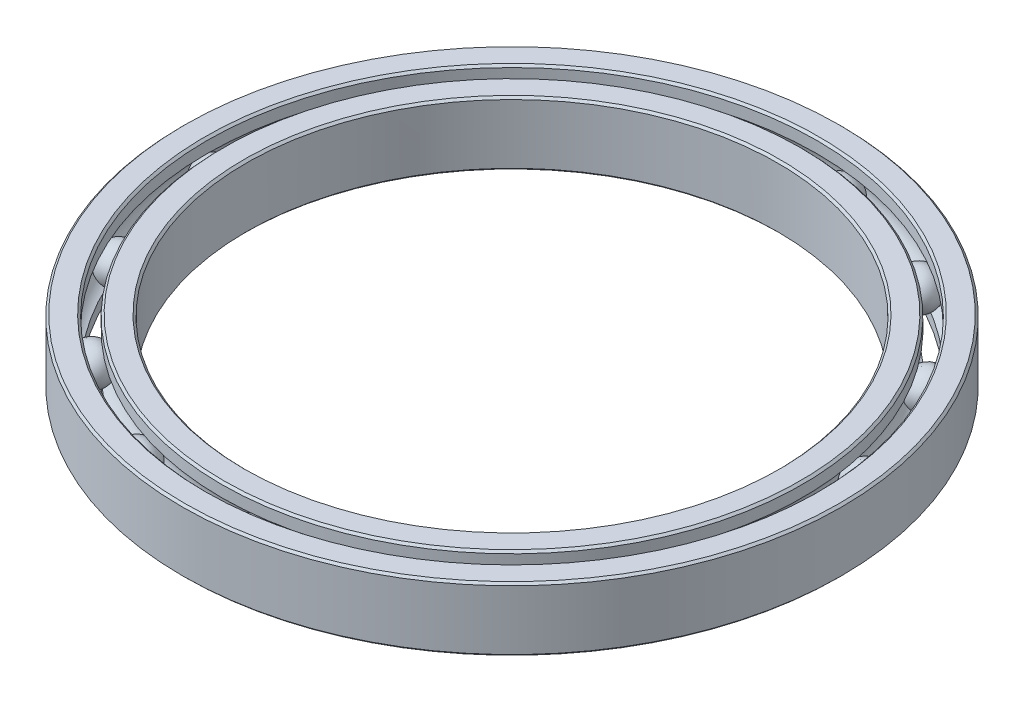
ISO-10303-21;
HEADER;
FILE_DESCRIPTION(('STEP AP214'),'2;1');
FILE_NAME('part.step','',(''),(''),'','','');
FILE_SCHEMA(('AUTOMOTIVE_DESIGN { 1 0 10303 214 1 1 1 1 }'));
ENDSEC;
DATA;
#1=APPLICATION_CONTEXT('core data for automotive mechanical design processes');
#2=APPLICATION_PROTOCOL_DEFINITION('international standard','automotive_design',2000,#1);
#3=PRODUCT_CONTEXT('',#1,'mechanical');
#4=PRODUCT('Part','Part','',(#3));
#5=PRODUCT_RELATED_PRODUCT_CATEGORY('part','',(#4));
#6=PRODUCT_DEFINITION_FORMATION('','',#4);
#7=PRODUCT_DEFINITION_CONTEXT('part definition',#1,'design');
#8=PRODUCT_DEFINITION('design','',#6,#7);
#9=PRODUCT_DEFINITION_SHAPE('','',#8);
#10=(LENGTH_UNIT() NAMED_UNIT(*) SI_UNIT(.MILLI.,.METRE.));
#11=(NAMED_UNIT(*) PLANE_ANGLE_UNIT() SI_UNIT($,.RADIAN.));
#12=(NAMED_UNIT(*) SI_UNIT($,.STERADIAN.) SOLID_ANGLE_UNIT());
#13=UNCERTAINTY_MEASURE_WITH_UNIT(LENGTH_MEASURE(1.E-05),#10,'distance_accuracy_value','');
#14=(GEOMETRIC_REPRESENTATION_CONTEXT(3) GLOBAL_UNCERTAINTY_ASSIGNED_CONTEXT((#13)) GLOBAL_UNIT_ASSIGNED_CONTEXT((#10,
#11,#12)) REPRESENTATION_CONTEXT('',''));
#15=CARTESIAN_POINT('',(0.,0.,0.));
#16=DIRECTION('',(0.,0.,1.));
#17=DIRECTION('',(1.,0.,0.));
#18=AXIS2_PLACEMENT_3D('',#15,#16,#17);
#19=CARTESIAN_POINT('',(-25.5792728139947,3.,-11.3886260061228));
#20=DIRECTION('',(-0.913545457642606,0.,-0.406736643075789));
#21=DIRECTION('',(0.,1.,0.));
#22=AXIS2_PLACEMENT_3D('',#19,#20,#21);
#23=SPHERICAL_SURFACE('',#22,1.823555732186);
#24=CARTESIAN_POINT('',(-27.2451738698913,3.,-12.1303329430938));
#25=VERTEX_POINT('',#24);
#26=VERTEX_LOOP('',#25);
#27=FACE_BOUND('',#26,.T.);
#28=ADVANCED_FACE('F36',(#27),#23,.T.);
#29=CLOSED_SHELL('',(#28));
#30=MANIFOLD_SOLID_BREP('B2',#29);
#31=CARTESIAN_POINT('',(-18.7356569780495,3.,-20.8080551133682));
#32=DIRECTION('',(-0.669130606358867,0.,-0.743144825477386));
#33=DIRECTION('',(0.,1.,0.));
#34=AXIS2_PLACEMENT_3D('',#31,#32,#33);
#35=SPHERICAL_SURFACE('',#34,1.823555732186);
#36=CARTESIAN_POINT('',(-19.9558539308563,3.,-22.1632211197119));
#37=VERTEX_POINT('',#36);
#38=VERTEX_LOOP('',#37);
#39=FACE_BOUND('',#38,.T.);
#40=ADVANCED_FACE('F55',(#39),#35,.T.);
#41=CLOSED_SHELL('',(#40));
#42=MANIFOLD_SOLID_BREP('B6',#41);
#43=CARTESIAN_POINT('',(-8.65247584249938,3.,-26.629582456266));
#44=DIRECTION('',(-0.309016994374957,0.,-0.95105651629515));
#45=DIRECTION('',(0.,1.,0.));
#46=AXIS2_PLACEMENT_3D('',#43,#44,#45);
#47=SPHERICAL_SURFACE('',#46,1.823555732186);
#48=CARTESIAN_POINT('',(-9.21598555393472,3.,-28.3638870181888));
#49=VERTEX_POINT('',#48);
#50=VERTEX_LOOP('',#49);
#51=FACE_BOUND('',#50,.T.);
#52=ADVANCED_FACE('F74',(#51),#47,.T.);
#53=CLOSED_SHELL('',(#52));
#54=MANIFOLD_SOLID_BREP('B32',#53);
#55=CARTESIAN_POINT('',(2.92679697149422,3.,-27.8466130703135));
#56=DIRECTION('',(0.104528463267644,0.,-0.994521895368274));
#57=DIRECTION('',(0.,1.,0.));
#58=AXIS2_PLACEMENT_3D('',#55,#56,#57);
#59=SPHERICAL_SURFACE('',#58,1.823555732186);
#60=CARTESIAN_POINT('',(3.11741044986252,3.,-29.6601791733968));
#61=VERTEX_POINT('',#60);
#62=VERTEX_LOOP('',#61);
#63=FACE_BOUND('',#62,.T.);
#64=ADVANCED_FACE('F93',(#63),#59,.T.);
#65=CLOSED_SHELL('',(#64));
#66=MANIFOLD_SOLID_BREP('B51',#65);
#67=CARTESIAN_POINT('',(14.0000000000007,3.,-24.248711305966));
#68=DIRECTION('',(0.499999999999992,0.,-0.866025403784443));
#69=DIRECTION('',(0.,1.,0.));
#70=AXIS2_PLACEMENT_3D('',#67,#68,#69);
#71=SPHERICAL_SURFACE('',#70,1.823555732186);
#72=CARTESIAN_POINT('',(14.9117778660937,3.,-25.8279568952558));
#73=VERTEX_POINT('',#72);
#74=VERTEX_LOOP('',#73);
#75=FACE_BOUND('',#74,.T.);
#76=ADVANCED_FACE('F112',(#75),#71,.T.);
#77=CLOSED_SHELL('',(#76));
#78=MANIFOLD_SOLID_BREP('B70',#77);
#79=CARTESIAN_POINT('',(22.6524758424999,3.,-16.4579870641905));
#80=DIRECTION('',(0.809016994374943,0.,-0.58778525229248));
#81=DIRECTION('',(0.,1.,0.));
#82=AXIS2_PLACEMENT_3D('',#79,#80,#81);
#83=SPHERICAL_SURFACE('',#82,1.823555732186);
#84=CARTESIAN_POINT('',(24.1277634200282,3.,-17.5298462303029));
#85=VERTEX_POINT('',#84);
#86=VERTEX_LOOP('',#85);
#87=FACE_BOUND('',#86,.T.);
#88=ADVANCED_FACE('F131',(#87),#83,.T.);
#89=CLOSED_SHELL('',(#88));
#90=MANIFOLD_SOLID_BREP('B89',#89);
#91=CARTESIAN_POINT('',(27.3881328205483,3.,-5.82152734289785));
#92=DIRECTION('',(0.978147600733804,0.,-0.207911690817766));
#93=DIRECTION('',(0.,1.,0.));
#94=AXIS2_PLACEMENT_3D('',#91,#92,#93);
#95=SPHERICAL_SURFACE('',#94,1.823555732186);
#96=CARTESIAN_POINT('',(29.1718394847904,3.,-6.20066589847707));
#97=VERTEX_POINT('',#96);
#98=VERTEX_LOOP('',#97);
#99=FACE_BOUND('',#98,.T.);
#100=ADVANCED_FACE('F150',(#99),#95,.T.);
#101=CLOSED_SHELL('',(#100));
#102=MANIFOLD_SOLID_BREP('B108',#101);
#103=CARTESIAN_POINT('',(27.3881328205484,3.,5.82152734289748));
#104=DIRECTION('',(0.978147600733807,0.,0.207911690817753));
#105=DIRECTION('',(0.,1.,0.));
#106=AXIS2_PLACEMENT_3D('',#103,#104,#105);
#107=SPHERICAL_SURFACE('',#106,1.823555732186);
#108=CARTESIAN_POINT('',(29.1718394847905,3.,6.20066589847668));
#109=VERTEX_POINT('',#108);
#110=VERTEX_LOOP('',#109);
#111=FACE_BOUND('',#110,.T.);
#112=ADVANCED_FACE('F169',(#111),#107,.T.);
#113=CLOSED_SHELL('',(#112));
#114=MANIFOLD_SOLID_BREP('B127',#113);
#115=CARTESIAN_POINT('',(22.6524758425001,3.,16.4579870641902));
#116=DIRECTION('',(0.80901699437495,0.,0.587785252292469));
#117=DIRECTION('',(0.,1.,0.));
#118=AXIS2_PLACEMENT_3D('',#115,#116,#117);
#119=SPHERICAL_SURFACE('',#118,1.823555732186);
#120=CARTESIAN_POINT('',(24.1277634200284,3.,17.5298462303025));
#121=VERTEX_POINT('',#120);
#122=VERTEX_LOOP('',#121);
#123=FACE_BOUND('',#122,.T.);
#124=ADVANCED_FACE('F188',(#123),#119,.T.);
#125=CLOSED_SHELL('',(#124));
#126=MANIFOLD_SOLID_BREP('B146',#125);
#127=CARTESIAN_POINT('',(14.000000000001,3.,24.2487113059658));
#128=DIRECTION('',(0.500000000000004,0.,0.866025403784436));
#129=DIRECTION('',(0.,1.,0.));
#130=AXIS2_PLACEMENT_3D('',#127,#128,#129);
#131=SPHERICAL_SURFACE('',#130,1.823555732186);
#132=CARTESIAN_POINT('',(14.9117778660941,3.,25.8279568952556));
#133=VERTEX_POINT('',#132);
#134=VERTEX_LOOP('',#133);
#135=FACE_BOUND('',#134,.T.);
#136=ADVANCED_FACE('F207',(#135),#131,.T.);
#137=CLOSED_SHELL('',(#136));
#138=MANIFOLD_SOLID_BREP('B165',#137);
#139=CARTESIAN_POINT('',(2.92679697149459,3.,27.8466130703135));
#140=DIRECTION('',(0.104528463267657,0.,0.994521895368273));
#141=DIRECTION('',(0.,1.,0.));
#142=AXIS2_PLACEMENT_3D('',#139,#140,#141);
#143=SPHERICAL_SURFACE('',#142,1.823555732186);
#144=CARTESIAN_POINT('',(3.11741044986292,3.,29.6601791733968));
#145=VERTEX_POINT('',#144);
#146=VERTEX_LOOP('',#145);
#147=FACE_BOUND('',#146,.T.);
#148=ADVANCED_FACE('F226',(#147),#143,.T.);
#149=CLOSED_SHELL('',(#148));
#150=MANIFOLD_SOLID_BREP('B184',#149);
#151=CARTESIAN_POINT('',(-8.65247584249903,3.,26.6295824562661));
#152=DIRECTION('',(-0.309016994374945,0.,0.951056516295154));
#153=DIRECTION('',(0.,1.,0.));
#154=AXIS2_PLACEMENT_3D('',#151,#152,#153);
#155=SPHERICAL_SURFACE('',#154,1.823555732186);
#156=CARTESIAN_POINT('',(-9.21598555393435,3.,28.363887018189));
#157=VERTEX_POINT('',#156);
#158=VERTEX_LOOP('',#157);
#159=FACE_BOUND('',#158,.T.);
#160=ADVANCED_FACE('F245',(#159),#155,.T.);
#161=CLOSED_SHELL('',(#160));
#162=MANIFOLD_SOLID_BREP('B203',#161);
#163=CARTESIAN_POINT('',(-18.7356569780492,3.,20.8080551133685));
#164=DIRECTION('',(-0.669130606358857,0.,0.743144825477395));
#165=DIRECTION('',(0.,1.,0.));
#166=AXIS2_PLACEMENT_3D('',#163,#164,#165);
#167=SPHERICAL_SURFACE('',#166,1.823555732186);
#168=CARTESIAN_POINT('',(-19.955853930856,3.,22.1632211197121));
#169=VERTEX_POINT('',#168);
#170=VERTEX_LOOP('',#169);
#171=FACE_BOUND('',#170,.T.);
#172=ADVANCED_FACE('F264',(#171),#167,.T.);
#173=CLOSED_SHELL('',(#172));
#174=MANIFOLD_SOLID_BREP('B222',#173);
#175=CARTESIAN_POINT('',(-25.5792728139945,3.,11.3886260061232));
#176=DIRECTION('',(-0.913545457642601,0.,0.406736643075801));
#177=DIRECTION('',(0.,1.,0.));
#178=AXIS2_PLACEMENT_3D('',#175,#176,#177);
#179=SPHERICAL_SURFACE('',#178,1.823555732186);
#180=CARTESIAN_POINT('',(-27.2451738698912,3.,12.1303329430942));
#181=VERTEX_POINT('',#180);
#182=VERTEX_LOOP('',#181);
#183=FACE_BOUND('',#182,.T.);
#184=ADVANCED_FACE('F283',(#183),#179,.T.);
#185=CLOSED_SHELL('',(#184));
#186=MANIFOLD_SOLID_BREP('B241',#185);
#187=CARTESIAN_POINT('',(-28.0000000000019,3.,0.));
#188=DIRECTION('',(-1.,0.,0.));
#189=DIRECTION('',(0.,1.,0.));
#190=AXIS2_PLACEMENT_3D('',#187,#188,#189);
#191=SPHERICAL_SURFACE('',#190,1.823555732186);
#192=CARTESIAN_POINT('',(-29.8235557321879,3.,0.));
#193=VERTEX_POINT('',#192);
#194=VERTEX_LOOP('',#193);
#195=FACE_BOUND('',#194,.T.);
#196=ADVANCED_FACE('F304',(#195),#191,.T.);
#197=CLOSED_SHELL('',(#196));
#198=MANIFOLD_SOLID_BREP('B260',#197);
#199=CARTESIAN_POINT('',(0.,3.,0.));
#200=DIRECTION('',(0.,1.,0.));
#201=DIRECTION('',(0.,0.,1.));
#202=AXIS2_PLACEMENT_3D('',#199,#200,#201);
#203=TOROIDAL_SURFACE('',#202,28.0000000000019,1.85405013614651);
#204=CARTESIAN_POINT('',(0.,1.27569042359071,0.));
#205=DIRECTION('',(0.,1.,0.));
#206=DIRECTION('',(0.,0.,1.));
#207=AXIS2_PLACEMENT_3D('',#204,#205,#206);
#208=CIRCLE('',#207,27.3186349054687);
#209=CARTESIAN_POINT('',(0.,1.27569042359071,27.3186349054687));
#210=VERTEX_POINT('',#209);
#211=EDGE_CURVE('E359',#210,#210,#208,.T.);
#212=ORIENTED_EDGE('',*,*,#211,.T.);
#213=EDGE_LOOP('',(#212));
#214=FACE_BOUND('',#213,.T.);
#215=CARTESIAN_POINT('',(0.,4.72430957640929,0.));
#216=DIRECTION('',(0.,1.,0.));
#217=DIRECTION('',(0.,0.,1.));
#218=AXIS2_PLACEMENT_3D('',#215,#216,#217);
#219=CIRCLE('',#218,27.3186349054687);
#220=CARTESIAN_POINT('',(0.,4.72430957640929,27.3186349054687));
#221=VERTEX_POINT('',#220);
#222=EDGE_CURVE('E356',#221,#221,#219,.T.);
#223=ORIENTED_EDGE('',*,*,#222,.F.);
#224=EDGE_LOOP('',(#223));
#225=FACE_BOUND('',#224,.T.);
#226=ADVANCED_FACE('F324',(#214,#225),#203,.F.);
#227=CARTESIAN_POINT('',(0.,0.,0.));
#228=DIRECTION('',(0.,1.,0.));
#229=DIRECTION('',(0.,0.,1.));
#230=AXIS2_PLACEMENT_3D('',#227,#228,#229);
#231=CYLINDRICAL_SURFACE('',#230,27.3186349054687);
#232=CARTESIAN_POINT('',(0.,5.79999999999998,0.));
#233=DIRECTION('',(0.,1.,0.));
#234=DIRECTION('',(0.,0.,1.));
#235=AXIS2_PLACEMENT_3D('',#232,#233,#234);
#236=CIRCLE('',#235,27.3186349054687);
#237=CARTESIAN_POINT('',(0.,5.79999999999998,-27.3186349054687));
#238=VERTEX_POINT('',#237);
#239=EDGE_CURVE('E303',#238,#238,#236,.F.);
#240=ORIENTED_EDGE('',*,*,#239,.T.);
#241=EDGE_LOOP('',(#240));
#242=FACE_BOUND('',#241,.T.);
#243=ORIENTED_EDGE('',*,*,#222,.T.);
#244=EDGE_LOOP('',(#243));
#245=FACE_BOUND('',#244,.T.);
#246=ADVANCED_FACE('F382',(#242,#245),#231,.T.);
#247=CARTESIAN_POINT('',(-25.,6.,0.));
#248=DIRECTION('',(0.,1.,0.));
#249=DIRECTION('',(0.,0.,1.));
#250=AXIS2_PLACEMENT_3D('',#247,#248,#249);
#251=PLANE('',#250);
#252=CARTESIAN_POINT('',(0.,6.,0.));
#253=DIRECTION('',(0.,1.,0.));
#254=DIRECTION('',(0.,0.,1.));
#255=AXIS2_PLACEMENT_3D('',#252,#253,#254);
#256=CIRCLE('',#255,25.2);
#257=CARTESIAN_POINT('',(0.,6.,25.2));
#258=VERTEX_POINT('',#257);
#259=EDGE_CURVE('E331',#258,#258,#256,.F.);
#260=ORIENTED_EDGE('',*,*,#259,.T.);
#261=EDGE_LOOP('',(#260));
#262=FACE_BOUND('',#261,.T.);
#263=CARTESIAN_POINT('',(0.,6.,0.));
#264=DIRECTION('',(0.,1.,0.));
#265=DIRECTION('',(0.,0.,1.));
#266=AXIS2_PLACEMENT_3D('',#263,#264,#265);
#267=CIRCLE('',#266,27.1186349054687);
#268=CARTESIAN_POINT('',(0.,6.,-27.1186349054687));
#269=VERTEX_POINT('',#268);
#270=EDGE_CURVE('E335',#269,#269,#267,.T.);
#271=ORIENTED_EDGE('',*,*,#270,.T.);
#272=EDGE_LOOP('',(#271));
#273=FACE_BOUND('',#272,.T.);
#274=ADVANCED_FACE('F387',(#262,#273),#251,.T.);
#275=CARTESIAN_POINT('',(0.,0.,0.));
#276=DIRECTION('',(0.,1.,0.));
#277=DIRECTION('',(0.,0.,1.));
#278=AXIS2_PLACEMENT_3D('',#275,#276,#277);
#279=CYLINDRICAL_SURFACE('',#278,25.);
#280=CARTESIAN_POINT('',(0.,0.200000000000006,0.));
#281=DIRECTION('',(0.,-1.,0.));
#282=DIRECTION('',(0.,0.,-1.));
#283=AXIS2_PLACEMENT_3D('',#280,#281,#282);
#284=CIRCLE('',#283,25.);
#285=CARTESIAN_POINT('',(0.,0.200000000000006,-25.));
#286=VERTEX_POINT('',#285);
#287=EDGE_CURVE('E339',#286,#286,#284,.T.);
#288=ORIENTED_EDGE('',*,*,#287,.T.);
#289=EDGE_LOOP('',(#288));
#290=FACE_BOUND('',#289,.T.);
#291=CARTESIAN_POINT('',(0.,5.80000000000001,0.));
#292=DIRECTION('',(0.,1.,0.));
#293=DIRECTION('',(0.,0.,1.));
#294=AXIS2_PLACEMENT_3D('',#291,#292,#293);
#295=CIRCLE('',#294,25.);
#296=CARTESIAN_POINT('',(0.,5.80000000000001,25.));
#297=VERTEX_POINT('',#296);
#298=EDGE_CURVE('E344',#297,#297,#295,.T.);
#299=ORIENTED_EDGE('',*,*,#298,.T.);
#300=EDGE_LOOP('',(#299));
#301=FACE_BOUND('',#300,.T.);
#302=ADVANCED_FACE('F378',(#290,#301),#279,.F.);
#303=CARTESIAN_POINT('',(-25.,0.,0.));
#304=DIRECTION('',(0.,-1.,0.));
#305=DIRECTION('',(0.,0.,-1.));
#306=AXIS2_PLACEMENT_3D('',#303,#304,#305);
#307=PLANE('',#306);
#308=CARTESIAN_POINT('',(0.,0.,0.));
#309=DIRECTION('',(0.,-1.,0.));
#310=DIRECTION('',(0.,0.,-1.));
#311=AXIS2_PLACEMENT_3D('',#308,#309,#310);
#312=CIRCLE('',#311,27.1186349054687);
#313=CARTESIAN_POINT('',(0.,0.,-27.1186349054687));
#314=VERTEX_POINT('',#313);
#315=EDGE_CURVE('E347',#314,#314,#312,.T.);
#316=ORIENTED_EDGE('',*,*,#315,.T.);
#317=EDGE_LOOP('',(#316));
#318=FACE_BOUND('',#317,.T.);
#319=CARTESIAN_POINT('',(0.,0.,0.));
#320=DIRECTION('',(0.,-1.,0.));
#321=DIRECTION('',(0.,0.,-1.));
#322=AXIS2_PLACEMENT_3D('',#319,#320,#321);
#323=CIRCLE('',#322,25.2);
#324=CARTESIAN_POINT('',(0.,0.,-25.2));
#325=VERTEX_POINT('',#324);
#326=EDGE_CURVE('E350',#325,#325,#323,.F.);
#327=ORIENTED_EDGE('',*,*,#326,.T.);
#328=EDGE_LOOP('',(#327));
#329=FACE_BOUND('',#328,.T.);
#330=ADVANCED_FACE('F368',(#318,#329),#307,.T.);
#331=CARTESIAN_POINT('',(0.,0.,0.));
#332=DIRECTION('',(0.,1.,0.));
#333=DIRECTION('',(0.,0.,1.));
#334=AXIS2_PLACEMENT_3D('',#331,#332,#333);
#335=CYLINDRICAL_SURFACE('',#334,27.3186349054687);
#336=CARTESIAN_POINT('',(0.,0.200000000000003,0.));
#337=DIRECTION('',(0.,-1.,0.));
#338=DIRECTION('',(0.,0.,-1.));
#339=AXIS2_PLACEMENT_3D('',#336,#337,#338);
#340=CIRCLE('',#339,27.3186349054687);
#341=CARTESIAN_POINT('',(0.,0.200000000000003,-27.3186349054687));
#342=VERTEX_POINT('',#341);
#343=EDGE_CURVE('E353',#342,#342,#340,.F.);
#344=ORIENTED_EDGE('',*,*,#343,.T.);
#345=EDGE_LOOP('',(#344));
#346=FACE_BOUND('',#345,.T.);
#347=ORIENTED_EDGE('',*,*,#211,.F.);
#348=EDGE_LOOP('',(#347));
#349=FACE_BOUND('',#348,.T.);
#350=ADVANCED_FACE('F365',(#346,#349),#335,.T.);
#351=CARTESIAN_POINT('',(0.,0.200000000000003,0.));
#352=DIRECTION('',(0.,1.,0.));
#353=DIRECTION('',(0.,0.,1.));
#354=AXIS2_PLACEMENT_3D('',#351,#352,#353);
#355=CONICAL_SURFACE('',#354,27.3186349054687,0.78539816339744);
#356=ORIENTED_EDGE('',*,*,#315,.F.);
#357=EDGE_LOOP('',(#356));
#358=FACE_BOUND('',#357,.T.);
#359=ORIENTED_EDGE('',*,*,#343,.F.);
#360=EDGE_LOOP('',(#359));
#361=FACE_BOUND('',#360,.T.);
#362=ADVANCED_FACE('F367',(#358,#361),#355,.T.);
#363=CARTESIAN_POINT('',(0.,0.,0.));
#364=DIRECTION('',(0.,-1.,0.));
#365=DIRECTION('',(0.,0.,-1.));
#366=AXIS2_PLACEMENT_3D('',#363,#364,#365);
#367=CONICAL_SURFACE('',#366,25.2,0.785398163397457);
#368=ORIENTED_EDGE('',*,*,#287,.F.);
#369=EDGE_LOOP('',(#368));
#370=FACE_BOUND('',#369,.T.);
#371=ORIENTED_EDGE('',*,*,#326,.F.);
#372=EDGE_LOOP('',(#371));
#373=FACE_BOUND('',#372,.T.);
#374=ADVANCED_FACE('F375',(#370,#373),#367,.F.);
#375=CARTESIAN_POINT('',(0.,5.80000000000001,0.));
#376=DIRECTION('',(0.,1.,0.));
#377=DIRECTION('',(0.,0.,1.));
#378=AXIS2_PLACEMENT_3D('',#375,#376,#377);
#379=CONICAL_SURFACE('',#378,25.,0.785398163397466);
#380=ORIENTED_EDGE('',*,*,#259,.F.);
#381=EDGE_LOOP('',(#380));
#382=FACE_BOUND('',#381,.T.);
#383=ORIENTED_EDGE('',*,*,#298,.F.);
#384=EDGE_LOOP('',(#383));
#385=FACE_BOUND('',#384,.T.);
#386=ADVANCED_FACE('F392',(#382,#385),#379,.F.);
#387=CARTESIAN_POINT('',(0.,6.,0.));
#388=DIRECTION('',(0.,-1.,0.));
#389=DIRECTION('',(0.,0.,-1.));
#390=AXIS2_PLACEMENT_3D('',#387,#388,#389);
#391=CONICAL_SURFACE('',#390,27.1186349054687,0.785398163397448);
#392=CARTESIAN_POINT('',(0.,5.79999999999998,-27.3186349054687));
#393=CARTESIAN_POINT('',(0.,5.80208333333332,-27.3165515721354));
#394=CARTESIAN_POINT('',(0.,5.80416666666665,-27.3144682388021));
#395=CARTESIAN_POINT('',(0.,5.80833333333332,-27.3103015721354));
#396=CARTESIAN_POINT('',(0.,5.81041666666665,-27.3082182388021));
#397=CARTESIAN_POINT('',(0.,5.81458333333332,-27.3040515721354));
#398=CARTESIAN_POINT('',(0.,5.81666666666665,-27.3019682388021));
#399=CARTESIAN_POINT('',(0.,5.82083333333332,-27.2978015721354));
#400=CARTESIAN_POINT('',(0.,5.82291666666665,-27.2957182388021));
#401=CARTESIAN_POINT('',(0.,5.82708333333332,-27.2915515721354));
#402=CARTESIAN_POINT('',(0.,5.82916666666665,-27.2894682388021));
#403=CARTESIAN_POINT('',(0.,5.83333333333332,-27.2853015721354));
#404=CARTESIAN_POINT('',(0.,5.83541666666665,-27.2832182388021));
#405=CARTESIAN_POINT('',(0.,5.83958333333332,-27.2790515721354));
#406=CARTESIAN_POINT('',(0.,5.84166666666665,-27.2769682388021));
#407=CARTESIAN_POINT('',(0.,5.84583333333332,-27.2728015721354));
#408=CARTESIAN_POINT('',(0.,5.84791666666665,-27.2707182388021));
#409=CARTESIAN_POINT('',(0.,5.85208333333332,-27.2665515721354));
#410=CARTESIAN_POINT('',(0.,5.85416666666665,-27.2644682388021));
#411=CARTESIAN_POINT('',(0.,5.85833333333332,-27.2603015721354));
#412=CARTESIAN_POINT('',(0.,5.86041666666666,-27.2582182388021));
#413=CARTESIAN_POINT('',(0.,5.86458333333332,-27.2540515721354));
#414=CARTESIAN_POINT('',(0.,5.86666666666666,-27.2519682388021));
#415=CARTESIAN_POINT('',(0.,5.87083333333332,-27.2478015721354));
#416=CARTESIAN_POINT('',(0.,5.87291666666666,-27.2457182388021));
#417=CARTESIAN_POINT('',(0.,5.87708333333332,-27.2415515721354));
#418=CARTESIAN_POINT('',(0.,5.87916666666666,-27.2394682388021));
#419=CARTESIAN_POINT('',(0.,5.88333333333332,-27.2353015721354));
#420=CARTESIAN_POINT('',(0.,5.88541666666666,-27.2332182388021));
#421=CARTESIAN_POINT('',(0.,5.88958333333332,-27.2290515721354));
#422=CARTESIAN_POINT('',(0.,5.89166666666666,-27.2269682388021));
#423=CARTESIAN_POINT('',(0.,5.89583333333332,-27.2228015721354));
#424=CARTESIAN_POINT('',(0.,5.89791666666666,-27.2207182388021));
#425=CARTESIAN_POINT('',(0.,5.90208333333333,-27.2165515721354));
#426=CARTESIAN_POINT('',(0.,5.90416666666666,-27.2144682388021));
#427=CARTESIAN_POINT('',(0.,5.90833333333333,-27.2103015721354));
#428=CARTESIAN_POINT('',(0.,5.91041666666666,-27.2082182388021));
#429=CARTESIAN_POINT('',(0.,5.91458333333333,-27.2040515721354));
#430=CARTESIAN_POINT('',(0.,5.91666666666666,-27.2019682388021));
#431=CARTESIAN_POINT('',(0.,5.92083333333333,-27.1978015721354));
#432=CARTESIAN_POINT('',(0.,5.92291666666666,-27.1957182388021));
#433=CARTESIAN_POINT('',(0.,5.92708333333333,-27.1915515721354));
#434=CARTESIAN_POINT('',(0.,5.92916666666666,-27.1894682388021));
#435=CARTESIAN_POINT('',(0.,5.93333333333333,-27.1853015721354));
#436=CARTESIAN_POINT('',(0.,5.93541666666666,-27.1832182388021));
#437=CARTESIAN_POINT('',(0.,5.93958333333333,-27.1790515721354));
#438=CARTESIAN_POINT('',(0.,5.94166666666666,-27.1769682388021));
#439=CARTESIAN_POINT('',(0.,5.94583333333333,-27.1728015721354));
#440=CARTESIAN_POINT('',(0.,5.94791666666666,-27.1707182388021));
#441=CARTESIAN_POINT('',(0.,5.95208333333333,-27.1665515721354));
#442=CARTESIAN_POINT('',(0.,5.95416666666666,-27.1644682388021));
#443=CARTESIAN_POINT('',(0.,5.95833333333333,-27.1603015721354));
#444=CARTESIAN_POINT('',(0.,5.96041666666666,-27.1582182388021));
#445=CARTESIAN_POINT('',(0.,5.96458333333333,-27.1540515721354));
#446=CARTESIAN_POINT('',(0.,5.96666666666666,-27.1519682388021));
#447=CARTESIAN_POINT('',(0.,5.97083333333333,-27.1478015721354));
#448=CARTESIAN_POINT('',(0.,5.97291666666666,-27.1457182388021));
#449=CARTESIAN_POINT('',(0.,5.97708333333333,-27.1415515721354));
#450=CARTESIAN_POINT('',(0.,5.97916666666666,-27.1394682388021));
#451=CARTESIAN_POINT('',(0.,5.98333333333333,-27.1353015721354));
#452=CARTESIAN_POINT('',(0.,5.98541666666667,-27.1332182388021));
#453=CARTESIAN_POINT('',(0.,5.98958333333333,-27.1290515721354));
#454=CARTESIAN_POINT('',(0.,5.99166666666667,-27.1269682388021));
#455=CARTESIAN_POINT('',(0.,5.99583333333333,-27.1228015721354));
#456=CARTESIAN_POINT('',(0.,5.99791666666667,-27.1207182388021));
#457=CARTESIAN_POINT('',(0.,6.,-27.1186349054687));
#458=B_SPLINE_CURVE_WITH_KNOTS('',3,(#392,#393,#394,#395,#396,#397,#398,#399,#400,#401,#402,
#403,#404,#405,#406,#407,#408,#409,#410,#411,#412,#413,#414,#415,#416,#417,#418,#419,#420,#421,
#422,#423,#424,#425,#426,#427,#428,#429,#430,#431,#432,#433,#434,#435,#436,#437,#438,#439,#440,
#441,#442,#443,#444,#445,#446,#447,#448,#449,#450,#451,#452,#453,#454,#455,#456,#457),
.UNSPECIFIED.,.F.,.F.,(4,2,2,2,2,2,2,2,2,2,2,2,2,2,2,2,2,2,2,2,2,2,2,2,2,2,2,2,2,2,2,2,4),(0.,
0.0088388347648321,0.017677669529666,0.0265165042944981,0.0353553390593296,0.0441941738241635,
0.0530330085889957,0.0618718433538271,0.0707106781186611,0.0795495128834932,0.0883883476483247,
0.0972271824131592,0.106066017177991,0.114904851942822,0.123743686707657,0.132582521472488,
0.14142135623732,0.150260191002154,0.159099025766986,0.167937860531818,0.176776695296652,
0.185615530061483,0.194454364826315,0.203293199591149,0.212132034355981,0.220970869120813,
0.229809703885647,0.238648538650479,0.247487373415313,0.256326208180144,0.265165042944976,
0.27400387770981,0.282842712474642),.UNSPECIFIED.);
#459=EDGE_CURVE('BSEAM326',#238,#269,#458,.T.);
#460=ORIENTED_EDGE('',*,*,#239,.F.);
#461=ORIENTED_EDGE('',*,*,#270,.F.);
#462=ORIENTED_EDGE('',*,*,#459,.T.);
#463=ORIENTED_EDGE('',*,*,#459,.F.);
#464=EDGE_LOOP('',(#460,#462,#461,#463));
#465=FACE_BOUND('',#464,.T.);
#466=ADVANCED_FACE('F326',(#465),#391,.T.);
#467=CLOSED_SHELL('',(#226,#246,#274,#302,#330,#350,#362,#374,#386,#466));
#468=MANIFOLD_SOLID_BREP('B279',#467);
#469=CARTESIAN_POINT('',(0.,0.,0.));
#470=DIRECTION('',(0.,1.,0.));
#471=DIRECTION('',(0.,0.,1.));
#472=AXIS2_PLACEMENT_3D('',#469,#470,#471);
#473=CYLINDRICAL_SURFACE('',#472,28.681365094535);
#474=CARTESIAN_POINT('',(0.,0.199999999999988,0.));
#475=DIRECTION('',(0.,-1.,0.));
#476=DIRECTION('',(0.,0.,-1.));
#477=AXIS2_PLACEMENT_3D('',#474,#475,#476);
#478=CIRCLE('',#477,28.681365094535);
#479=CARTESIAN_POINT('',(0.,0.199999999999988,-28.681365094535));
#480=VERTEX_POINT('',#479);
#481=EDGE_CURVE('E323',#480,#480,#478,.T.);
#482=ORIENTED_EDGE('',*,*,#481,.T.);
#483=EDGE_LOOP('',(#482));
#484=FACE_BOUND('',#483,.T.);
#485=CARTESIAN_POINT('',(0.,1.27569042359071,0.));
#486=DIRECTION('',(0.,1.,0.));
#487=DIRECTION('',(0.,0.,1.));
#488=AXIS2_PLACEMENT_3D('',#485,#486,#487);
#489=CIRCLE('',#488,28.681365094535);
#490=CARTESIAN_POINT('',(0.,1.27569042359071,28.681365094535));
#491=VERTEX_POINT('',#490);
#492=EDGE_CURVE('E508',#491,#491,#489,.T.);
#493=ORIENTED_EDGE('',*,*,#492,.T.);
#494=EDGE_LOOP('',(#493));
#495=FACE_BOUND('',#494,.T.);
#496=ADVANCED_FACE('F476',(#484,#495),#473,.F.);
#497=CARTESIAN_POINT('',(0.,3.,0.));
#498=DIRECTION('',(0.,1.,0.));
#499=DIRECTION('',(0.,0.,1.));
#500=AXIS2_PLACEMENT_3D('',#497,#498,#499);
#501=TOROIDAL_SURFACE('',#500,28.0000000000019,1.85405013614651);
#502=CARTESIAN_POINT('',(0.,4.72430957640929,0.));
#503=DIRECTION('',(0.,1.,0.));
#504=DIRECTION('',(0.,0.,1.));
#505=AXIS2_PLACEMENT_3D('',#502,#503,#504);
#506=CIRCLE('',#505,28.681365094535);
#507=CARTESIAN_POINT('',(0.,4.72430957640929,28.681365094535));
#508=VERTEX_POINT('',#507);
#509=EDGE_CURVE('E511',#508,#508,#506,.T.);
#510=ORIENTED_EDGE('',*,*,#509,.T.);
#511=EDGE_LOOP('',(#510));
#512=FACE_BOUND('',#511,.T.);
#513=ORIENTED_EDGE('',*,*,#492,.F.);
#514=EDGE_LOOP('',(#513));
#515=FACE_BOUND('',#514,.T.);
#516=ADVANCED_FACE('F515',(#512,#515),#501,.F.);
#517=CARTESIAN_POINT('',(0.,0.,0.));
#518=DIRECTION('',(0.,1.,0.));
#519=DIRECTION('',(0.,0.,1.));
#520=AXIS2_PLACEMENT_3D('',#517,#518,#519);
#521=CYLINDRICAL_SURFACE('',#520,28.681365094535);
#522=CARTESIAN_POINT('',(0.,5.79999999999999,0.));
#523=DIRECTION('',(0.,1.,0.));
#524=DIRECTION('',(0.,0.,1.));
#525=AXIS2_PLACEMENT_3D('',#522,#523,#524);
#526=CIRCLE('',#525,28.681365094535);
#527=CARTESIAN_POINT('',(0.,5.79999999999999,28.681365094535));
#528=VERTEX_POINT('',#527);
#529=EDGE_CURVE('E505',#528,#528,#526,.T.);
#530=ORIENTED_EDGE('',*,*,#529,.T.);
#531=EDGE_LOOP('',(#530));
#532=FACE_BOUND('',#531,.T.);
#533=ORIENTED_EDGE('',*,*,#509,.F.);
#534=EDGE_LOOP('',(#533));
#535=FACE_BOUND('',#534,.T.);
#536=ADVANCED_FACE('F518',(#532,#535),#521,.F.);
#537=CARTESIAN_POINT('',(-31.0000000000037,6.,0.));
#538=DIRECTION('',(0.,1.,0.));
#539=DIRECTION('',(0.,0.,1.));
#540=AXIS2_PLACEMENT_3D('',#537,#538,#539);
#541=PLANE('',#540);
#542=CARTESIAN_POINT('',(0.,6.,0.));
#543=DIRECTION('',(0.,1.,0.));
#544=DIRECTION('',(0.,0.,1.));
#545=AXIS2_PLACEMENT_3D('',#542,#543,#544);
#546=CIRCLE('',#545,28.881365094535);
#547=CARTESIAN_POINT('',(0.,6.,28.881365094535));
#548=VERTEX_POINT('',#547);
#549=EDGE_CURVE('E499',#548,#548,#546,.F.);
#550=ORIENTED_EDGE('',*,*,#549,.T.);
#551=EDGE_LOOP('',(#550));
#552=FACE_BOUND('',#551,.T.);
#553=CARTESIAN_POINT('',(0.,6.,0.));
#554=DIRECTION('',(0.,1.,0.));
#555=DIRECTION('',(0.,0.,1.));
#556=AXIS2_PLACEMENT_3D('',#553,#554,#555);
#557=CIRCLE('',#556,30.8000000000037);
#558=CARTESIAN_POINT('',(0.,6.,30.8000000000037));
#559=VERTEX_POINT('',#558);
#560=EDGE_CURVE('E502',#559,#559,#557,.T.);
#561=ORIENTED_EDGE('',*,*,#560,.T.);
#562=EDGE_LOOP('',(#561));
#563=FACE_BOUND('',#562,.T.);
#564=ADVANCED_FACE('F520',(#552,#563),#541,.T.);
#565=CARTESIAN_POINT('',(0.,0.,0.));
#566=DIRECTION('',(0.,1.,0.));
#567=DIRECTION('',(0.,0.,1.));
#568=AXIS2_PLACEMENT_3D('',#565,#566,#567);
#569=CYLINDRICAL_SURFACE('',#568,31.0000000000037);
#570=CARTESIAN_POINT('',(0.,5.79999999999999,0.));
#571=DIRECTION('',(0.,1.,0.));
#572=DIRECTION('',(0.,0.,1.));
#573=AXIS2_PLACEMENT_3D('',#570,#571,#572);
#574=CIRCLE('',#573,31.0000000000037);
#575=CARTESIAN_POINT('',(0.,5.79999999999999,31.0000000000037));
#576=VERTEX_POINT('',#575);
#577=EDGE_CURVE('E491',#576,#576,#574,.F.);
#578=ORIENTED_EDGE('',*,*,#577,.T.);
#579=EDGE_LOOP('',(#578));
#580=FACE_BOUND('',#579,.T.);
#581=CARTESIAN_POINT('',(0.,0.199999999999985,0.));
#582=DIRECTION('',(0.,-1.,0.));
#583=DIRECTION('',(0.,0.,-1.));
#584=AXIS2_PLACEMENT_3D('',#581,#582,#583);
#585=CIRCLE('',#584,31.0000000000037);
#586=CARTESIAN_POINT('',(0.,0.199999999999985,-31.0000000000037));
#587=VERTEX_POINT('',#586);
#588=EDGE_CURVE('E496',#587,#587,#585,.F.);
#589=ORIENTED_EDGE('',*,*,#588,.T.);
#590=EDGE_LOOP('',(#589));
#591=FACE_BOUND('',#590,.T.);
#592=ADVANCED_FACE('F527',(#580,#591),#569,.T.);
#593=CARTESIAN_POINT('',(-28.681365094535,0.,0.));
#594=DIRECTION('',(0.,-1.,0.));
#595=DIRECTION('',(0.,0.,-1.));
#596=AXIS2_PLACEMENT_3D('',#593,#594,#595);
#597=PLANE('',#596);
#598=CARTESIAN_POINT('',(0.,0.,0.));
#599=DIRECTION('',(0.,-1.,0.));
#600=DIRECTION('',(0.,0.,-1.));
#601=AXIS2_PLACEMENT_3D('',#598,#599,#600);
#602=CIRCLE('',#601,30.8000000000037);
#603=CARTESIAN_POINT('',(0.,0.,-30.8000000000037));
#604=VERTEX_POINT('',#603);
#605=EDGE_CURVE('E483',#604,#604,#602,.T.);
#606=ORIENTED_EDGE('',*,*,#605,.T.);
#607=EDGE_LOOP('',(#606));
#608=FACE_BOUND('',#607,.T.);
#609=CARTESIAN_POINT('',(0.,0.,0.));
#610=DIRECTION('',(0.,-1.,0.));
#611=DIRECTION('',(0.,0.,-1.));
#612=AXIS2_PLACEMENT_3D('',#609,#610,#611);
#613=CIRCLE('',#612,28.881365094535);
#614=CARTESIAN_POINT('',(0.,0.,-28.881365094535));
#615=VERTEX_POINT('',#614);
#616=EDGE_CURVE('E487',#615,#615,#613,.F.);
#617=ORIENTED_EDGE('',*,*,#616,.T.);
#618=EDGE_LOOP('',(#617));
#619=FACE_BOUND('',#618,.T.);
#620=ADVANCED_FACE('F541',(#608,#619),#597,.T.);
#621=CARTESIAN_POINT('',(0.,5.79999999999999,0.));
#622=DIRECTION('',(0.,1.,0.));
#623=DIRECTION('',(0.,0.,1.));
#624=AXIS2_PLACEMENT_3D('',#621,#622,#623);
#625=CONICAL_SURFACE('',#624,28.681365094535,0.785398163397431);
#626=ORIENTED_EDGE('',*,*,#549,.F.);
#627=EDGE_LOOP('',(#626));
#628=FACE_BOUND('',#627,.T.);
#629=ORIENTED_EDGE('',*,*,#529,.F.);
#630=EDGE_LOOP('',(#629));
#631=FACE_BOUND('',#630,.T.);
#632=ADVANCED_FACE('F537',(#628,#631),#625,.F.);
#633=CARTESIAN_POINT('',(0.,6.,0.));
#634=DIRECTION('',(0.,-1.,0.));
#635=DIRECTION('',(0.,0.,-1.));
#636=AXIS2_PLACEMENT_3D('',#633,#634,#635);
#637=CONICAL_SURFACE('',#636,30.8000000000037,0.785398163397448);
#638=ORIENTED_EDGE('',*,*,#577,.F.);
#639=EDGE_LOOP('',(#638));
#640=FACE_BOUND('',#639,.T.);
#641=ORIENTED_EDGE('',*,*,#560,.F.);
#642=EDGE_LOOP('',(#641));
#643=FACE_BOUND('',#642,.T.);
#644=ADVANCED_FACE('F540',(#640,#643),#637,.T.);
#645=CARTESIAN_POINT('',(0.,0.199999999999985,0.));
#646=DIRECTION('',(0.,1.,0.));
#647=DIRECTION('',(0.,0.,1.));
#648=AXIS2_PLACEMENT_3D('',#645,#646,#647);
#649=CONICAL_SURFACE('',#648,31.0000000000037,0.785398163397474);
#650=ORIENTED_EDGE('',*,*,#605,.F.);
#651=EDGE_LOOP('',(#650));
#652=FACE_BOUND('',#651,.T.);
#653=ORIENTED_EDGE('',*,*,#588,.F.);
#654=EDGE_LOOP('',(#653));
#655=FACE_BOUND('',#654,.T.);
#656=ADVANCED_FACE('F544',(#652,#655),#649,.T.);
#657=CARTESIAN_POINT('',(0.,0.,0.));
#658=DIRECTION('',(0.,-1.,0.));
#659=DIRECTION('',(0.,0.,-1.));
#660=AXIS2_PLACEMENT_3D('',#657,#658,#659);
#661=CONICAL_SURFACE('',#660,28.881365094535,0.78539816339744);
#662=CARTESIAN_POINT('',(0.,0.199999999999988,-28.681365094535));
#663=CARTESIAN_POINT('',(0.,0.197916666666655,-28.6834484278683));
#664=CARTESIAN_POINT('',(0.,0.195833333333322,-28.6855317612016));
#665=CARTESIAN_POINT('',(0.,0.191666666666656,-28.6896984278683));
#666=CARTESIAN_POINT('',(0.,0.189583333333322,-28.6917817612016));
#667=CARTESIAN_POINT('',(0.,0.185416666666656,-28.6959484278683));
#668=CARTESIAN_POINT('',(0.,0.183333333333323,-28.6980317612016));
#669=CARTESIAN_POINT('',(0.,0.179166666666656,-28.7021984278683));
#670=CARTESIAN_POINT('',(0.,0.177083333333323,-28.7042817612016));
#671=CARTESIAN_POINT('',(0.,0.172916666666657,-28.7084484278683));
#672=CARTESIAN_POINT('',(0.,0.170833333333323,-28.7105317612016));
#673=CARTESIAN_POINT('',(0.,0.166666666666657,-28.7146984278683));
#674=CARTESIAN_POINT('',(0.,0.164583333333324,-28.7167817612016));
#675=CARTESIAN_POINT('',(0.,0.160416666666657,-28.7209484278683));
#676=CARTESIAN_POINT('',(0.,0.158333333333324,-28.7230317612016));
#677=CARTESIAN_POINT('',(0.,0.154166666666658,-28.7271984278683));
#678=CARTESIAN_POINT('',(0.,0.152083333333324,-28.7292817612016));
#679=CARTESIAN_POINT('',(0.,0.147916666666658,-28.7334484278683));
#680=CARTESIAN_POINT('',(0.,0.145833333333325,-28.7355317612016));
#681=CARTESIAN_POINT('',(0.,0.141666666666659,-28.7396984278683));
#682=CARTESIAN_POINT('',(0.,0.139583333333325,-28.7417817612016));
#683=CARTESIAN_POINT('',(0.,0.135416666666659,-28.7459484278683));
#684=CARTESIAN_POINT('',(0.,0.133333333333326,-28.7480317612016));
#685=CARTESIAN_POINT('',(0.,0.129166666666659,-28.7521984278683));
#686=CARTESIAN_POINT('',(0.,0.127083333333326,-28.7542817612016));
#687=CARTESIAN_POINT('',(0.,0.12291666666666,-28.7584484278683));
#688=CARTESIAN_POINT('',(0.,0.120833333333326,-28.7605317612016));
#689=CARTESIAN_POINT('',(0.,0.11666666666666,-28.7646984278683));
#690=CARTESIAN_POINT('',(0.,0.114583333333327,-28.7667817612016));
#691=CARTESIAN_POINT('',(0.,0.11041666666666,-28.7709484278683));
#692=CARTESIAN_POINT('',(0.,0.108333333333327,-28.7730317612016));
#693=CARTESIAN_POINT('',(0.,0.104166666666661,-28.7771984278683));
#694=CARTESIAN_POINT('',(0.,0.102083333333327,-28.7792817612016));
#695=CARTESIAN_POINT('',(0.,0.097916666666661,-28.7834484278683));
#696=CARTESIAN_POINT('',(0.,0.0958333333333278,-28.7855317612016));
#697=CARTESIAN_POINT('',(0.,0.0916666666666614,-28.7896984278683));
#698=CARTESIAN_POINT('',(0.,0.0895833333333281,-28.7917817612016));
#699=CARTESIAN_POINT('',(0.,0.0854166666666617,-28.7959484278683));
#700=CARTESIAN_POINT('',(0.,0.0833333333333285,-28.7980317612016));
#701=CARTESIAN_POINT('',(0.,0.0791666666666621,-28.8021984278683));
#702=CARTESIAN_POINT('',(0.,0.0770833333333289,-28.8042817612016));
#703=CARTESIAN_POINT('',(0.,0.0729166666666624,-28.8084484278683));
#704=CARTESIAN_POINT('',(0.,0.0708333333333292,-28.8105317612016));
#705=CARTESIAN_POINT('',(0.,0.0666666666666628,-28.8146984278683));
#706=CARTESIAN_POINT('',(0.,0.0645833333333297,-28.8167817612016));
#707=CARTESIAN_POINT('',(0.,0.0604166666666631,-28.8209484278683));
#708=CARTESIAN_POINT('',(0.,0.0583333333333296,-28.8230317612016));
#709=CARTESIAN_POINT('',(0.,0.0541666666666633,-28.8271984278683));
#710=CARTESIAN_POINT('',(0.,0.0520833333333305,-28.8292817612016));
#711=CARTESIAN_POINT('',(0.,0.0479166666666642,-28.8334484278683));
#712=CARTESIAN_POINT('',(0.,0.0458333333333308,-28.8355317612016));
#713=CARTESIAN_POINT('',(0.,0.0416666666666641,-28.8396984278683));
#714=CARTESIAN_POINT('',(0.,0.039583333333331,-28.8417817612016));
#715=CARTESIAN_POINT('',(0.,0.0354166666666646,-28.8459484278683));
#716=CARTESIAN_POINT('',(0.,0.0333333333333314,-28.8480317612016));
#717=CARTESIAN_POINT('',(0.,0.029166666666665,-28.8521984278683));
#718=CARTESIAN_POINT('',(0.,0.0270833333333318,-28.8542817612016));
#719=CARTESIAN_POINT('',(0.,0.0229166666666653,-28.8584484278683));
#720=CARTESIAN_POINT('',(0.,0.0208333333333321,-28.8605317612016));
#721=CARTESIAN_POINT('',(0.,0.0166666666666657,-28.8646984278683));
#722=CARTESIAN_POINT('',(0.,0.0145833333333325,-28.8667817612016));
#723=CARTESIAN_POINT('',(0.,0.0104166666666661,-28.8709484278683));
#724=CARTESIAN_POINT('',(0.,0.00833333333333285,-28.8730317612016));
#725=CARTESIAN_POINT('',(0.,0.00416666666666642,-28.8771984278683));
#726=CARTESIAN_POINT('',(0.,0.00208333333333321,-28.8792817612016));
#727=CARTESIAN_POINT('',(0.,0.,-28.881365094535));
#728=B_SPLINE_CURVE_WITH_KNOTS('',3,(#662,#663,#664,#665,#666,#667,#668,#669,#670,#671,#672,
#673,#674,#675,#676,#677,#678,#679,#680,#681,#682,#683,#684,#685,#686,#687,#688,#689,#690,#691,
#692,#693,#694,#695,#696,#697,#698,#699,#700,#701,#702,#703,#704,#705,#706,#707,#708,#709,#710,
#711,#712,#713,#714,#715,#716,#717,#718,#719,#720,#721,#722,#723,#724,#725,#726,#727),
.UNSPECIFIED.,.F.,.F.,(4,2,2,2,2,2,2,2,2,2,2,2,2,2,2,2,2,2,2,2,2,2,2,2,2,2,2,2,2,2,2,2,4),(0.,
0.0088388347648311,0.0176776695296622,0.0265165042944933,0.0353553390593244,0.0441941738241555,
0.0530330085889866,0.0618718433538177,0.0707106781186488,0.0795495128834823,0.0883883476483134,
0.0972271824131445,0.106066017177976,0.114904851942807,0.123743686707638,0.132582521472469,
0.1414213562373,0.150260191002131,0.159099025766962,0.167937860531793,0.176776695296624,
0.185615530061456,0.194454364826287,0.203293199591118,0.212132034355951,0.220970869120782,
0.229809703885613,0.238648538650445,0.247487373415276,0.256326208180107,0.265165042944938,
0.274003877709769,0.2828427124746),.UNSPECIFIED.);
#729=EDGE_CURVE('BSEAM478',#480,#615,#728,.T.);
#730=ORIENTED_EDGE('',*,*,#481,.F.);
#731=ORIENTED_EDGE('',*,*,#616,.F.);
#732=ORIENTED_EDGE('',*,*,#729,.T.);
#733=ORIENTED_EDGE('',*,*,#729,.F.);
#734=EDGE_LOOP('',(#730,#732,#731,#733));
#735=FACE_BOUND('',#734,.T.);
#736=ADVANCED_FACE('F478',(#735),#661,.F.);
#737=CLOSED_SHELL('',(#496,#516,#536,#564,#592,#620,#632,#644,#656,#736));
#738=MANIFOLD_SOLID_BREP('B298',#737);
#739=ADVANCED_BREP_SHAPE_REPRESENTATION('',(#18,#30,#42,#54,#66,#78,#90,#102,#114,#126,#138,
#150,#162,#174,#186,#198,#468,#738),#14);
#740=SHAPE_DEFINITION_REPRESENTATION(#9,#739);
ENDSEC;
END-ISO-10303-21;
